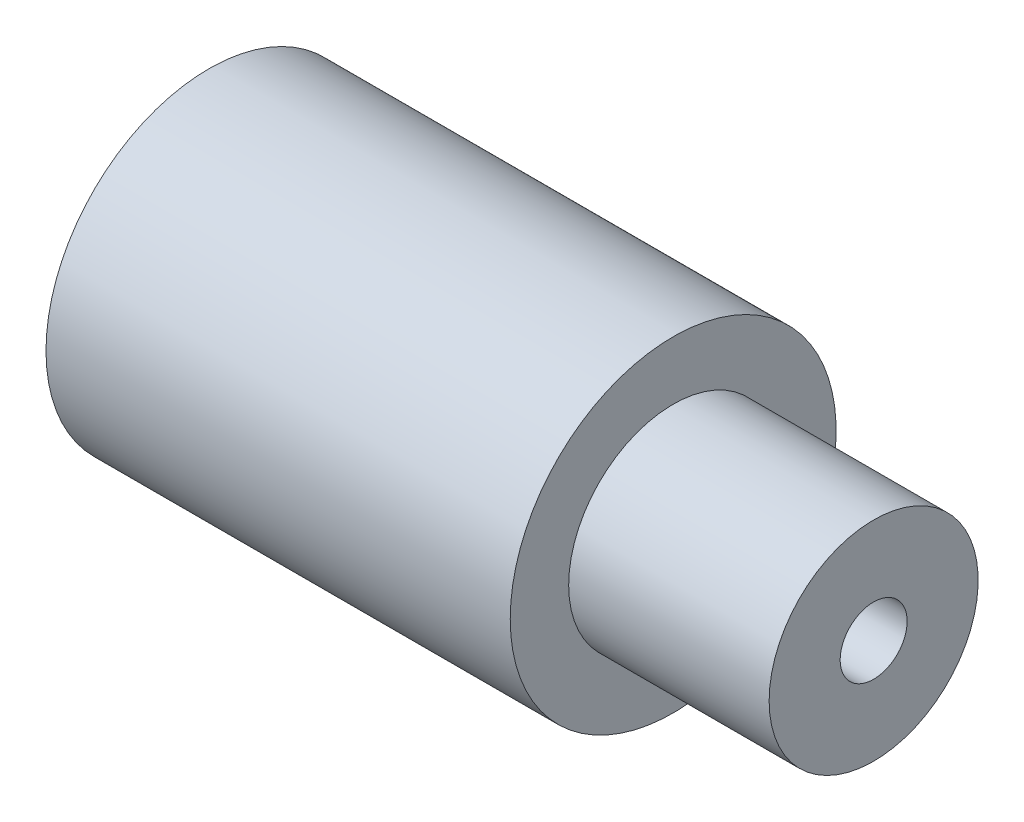
ISO-10303-21;
HEADER;
FILE_DESCRIPTION(('STEP AP214'),'2;1');
FILE_NAME('part.step','',(''),(''),'','','');
FILE_SCHEMA(('AUTOMOTIVE_DESIGN { 1 0 10303 214 1 1 1 1 }'));
ENDSEC;
DATA;
#1=APPLICATION_CONTEXT('core data for automotive mechanical design processes');
#2=APPLICATION_PROTOCOL_DEFINITION('international standard','automotive_design',2000,#1);
#3=PRODUCT_CONTEXT('',#1,'mechanical');
#4=PRODUCT('Part','Part','',(#3));
#5=PRODUCT_RELATED_PRODUCT_CATEGORY('part','',(#4));
#6=PRODUCT_DEFINITION_FORMATION('','',#4);
#7=PRODUCT_DEFINITION_CONTEXT('part definition',#1,'design');
#8=PRODUCT_DEFINITION('design','',#6,#7);
#9=PRODUCT_DEFINITION_SHAPE('','',#8);
#10=(LENGTH_UNIT() NAMED_UNIT(*) SI_UNIT(.MILLI.,.METRE.));
#11=(NAMED_UNIT(*) PLANE_ANGLE_UNIT() SI_UNIT($,.RADIAN.));
#12=(NAMED_UNIT(*) SI_UNIT($,.STERADIAN.) SOLID_ANGLE_UNIT());
#13=UNCERTAINTY_MEASURE_WITH_UNIT(LENGTH_MEASURE(1.E-05),#10,'distance_accuracy_value','');
#14=(GEOMETRIC_REPRESENTATION_CONTEXT(3) GLOBAL_UNCERTAINTY_ASSIGNED_CONTEXT((#13)) GLOBAL_UNIT_ASSIGNED_CONTEXT((#10,
#11,#12)) REPRESENTATION_CONTEXT('',''));
#15=CARTESIAN_POINT('',(0.,0.,0.));
#16=DIRECTION('',(0.,0.,1.));
#17=DIRECTION('',(1.,0.,0.));
#18=AXIS2_PLACEMENT_3D('',#15,#16,#17);
#19=CARTESIAN_POINT('',(9.5,0.,0.));
#20=DIRECTION('',(-1.,0.,0.));
#21=DIRECTION('',(0.,0.,1.));
#22=AXIS2_PLACEMENT_3D('',#19,#20,#21);
#23=PLANE('',#22);
#24=CARTESIAN_POINT('',(9.50000000000006,0.,0.));
#25=DIRECTION('',(-1.,0.,0.));
#26=DIRECTION('',(0.,0.,1.));
#27=AXIS2_PLACEMENT_3D('',#24,#25,#26);
#28=CIRCLE('',#27,1.5875);
#29=CARTESIAN_POINT('',(9.50000000000006,0.,1.5875));
#30=VERTEX_POINT('',#29);
#31=EDGE_CURVE('E59',#30,#30,#28,.F.);
#32=ORIENTED_EDGE('',*,*,#31,.F.);
#33=EDGE_LOOP('',(#32));
#34=FACE_BOUND('',#33,.T.);
#35=CARTESIAN_POINT('',(9.50000000000006,0.,0.));
#36=DIRECTION('',(-1.,0.,0.));
#37=DIRECTION('',(0.,0.,1.));
#38=AXIS2_PLACEMENT_3D('',#35,#36,#37);
#39=CIRCLE('',#38,4.953);
#40=CARTESIAN_POINT('',(9.50000000000006,0.,4.953));
#41=VERTEX_POINT('',#40);
#42=EDGE_CURVE('E10',#41,#41,#39,.T.);
#43=ORIENTED_EDGE('',*,*,#42,.F.);
#44=EDGE_LOOP('',(#43));
#45=FACE_BOUND('',#44,.T.);
#46=ADVANCED_FACE('F39',(#34,#45),#23,.F.);
#47=CARTESIAN_POINT('',(-1000.,0.,0.));
#48=DIRECTION('',(-1.,0.,0.));
#49=DIRECTION('',(0.,0.,1.));
#50=AXIS2_PLACEMENT_3D('',#47,#48,#49);
#51=CYLINDRICAL_SURFACE('',#50,4.953);
#52=CARTESIAN_POINT('',(0.,0.,0.));
#53=DIRECTION('',(-1.,0.,0.));
#54=DIRECTION('',(0.,0.,1.));
#55=AXIS2_PLACEMENT_3D('',#52,#53,#54);
#56=CIRCLE('',#55,4.953);
#57=CARTESIAN_POINT('',(0.,0.,4.953));
#58=VERTEX_POINT('',#57);
#59=EDGE_CURVE('E46',#58,#58,#56,.T.);
#60=ORIENTED_EDGE('',*,*,#59,.F.);
#61=EDGE_LOOP('',(#60));
#62=FACE_BOUND('',#61,.T.);
#63=ORIENTED_EDGE('',*,*,#42,.T.);
#64=EDGE_LOOP('',(#63));
#65=FACE_BOUND('',#64,.T.);
#66=ADVANCED_FACE('F84',(#62,#65),#51,.T.);
#67=CARTESIAN_POINT('',(0.,4.953,0.));
#68=DIRECTION('',(-1.,0.,0.));
#69=DIRECTION('',(0.,0.,1.));
#70=AXIS2_PLACEMENT_3D('',#67,#68,#69);
#71=PLANE('',#70);
#72=CARTESIAN_POINT('',(0.,0.,0.));
#73=DIRECTION('',(-1.,0.,0.));
#74=DIRECTION('',(0.,0.,1.));
#75=AXIS2_PLACEMENT_3D('',#72,#73,#74);
#76=CIRCLE('',#75,7.722);
#77=CARTESIAN_POINT('',(0.,0.,7.722));
#78=VERTEX_POINT('',#77);
#79=EDGE_CURVE('E49',#78,#78,#76,.T.);
#80=ORIENTED_EDGE('',*,*,#79,.F.);
#81=EDGE_LOOP('',(#80));
#82=FACE_BOUND('',#81,.T.);
#83=ORIENTED_EDGE('',*,*,#59,.T.);
#84=EDGE_LOOP('',(#83));
#85=FACE_BOUND('',#84,.T.);
#86=ADVANCED_FACE('F79',(#82,#85),#71,.F.);
#87=CARTESIAN_POINT('',(-1000.,0.,0.));
#88=DIRECTION('',(-1.,0.,0.));
#89=DIRECTION('',(0.,0.,1.));
#90=AXIS2_PLACEMENT_3D('',#87,#88,#89);
#91=CYLINDRICAL_SURFACE('',#90,7.722);
#92=CARTESIAN_POINT('',(-22.,0.,0.));
#93=DIRECTION('',(-1.,0.,0.));
#94=DIRECTION('',(0.,0.,1.));
#95=AXIS2_PLACEMENT_3D('',#92,#93,#94);
#96=CIRCLE('',#95,7.722);
#97=CARTESIAN_POINT('',(-22.,0.,7.722));
#98=VERTEX_POINT('',#97);
#99=EDGE_CURVE('E54',#98,#98,#96,.T.);
#100=ORIENTED_EDGE('',*,*,#99,.F.);
#101=EDGE_LOOP('',(#100));
#102=FACE_BOUND('',#101,.T.);
#103=ORIENTED_EDGE('',*,*,#79,.T.);
#104=EDGE_LOOP('',(#103));
#105=FACE_BOUND('',#104,.T.);
#106=ADVANCED_FACE('F68',(#102,#105),#91,.T.);
#107=CARTESIAN_POINT('',(-22.,7.722,0.));
#108=DIRECTION('',(1.,0.,0.));
#109=DIRECTION('',(0.,0.,-1.));
#110=AXIS2_PLACEMENT_3D('',#107,#108,#109);
#111=PLANE('',#110);
#112=CARTESIAN_POINT('',(-22.,0.,0.));
#113=DIRECTION('',(1.,0.,0.));
#114=DIRECTION('',(0.,0.,-1.));
#115=AXIS2_PLACEMENT_3D('',#112,#113,#114);
#116=CIRCLE('',#115,1.5875);
#117=CARTESIAN_POINT('',(-22.,0.,-1.5875));
#118=VERTEX_POINT('',#117);
#119=EDGE_CURVE('E45',#118,#118,#116,.F.);
#120=ORIENTED_EDGE('',*,*,#119,.F.);
#121=EDGE_LOOP('',(#120));
#122=FACE_BOUND('',#121,.T.);
#123=ORIENTED_EDGE('',*,*,#99,.T.);
#124=EDGE_LOOP('',(#123));
#125=FACE_BOUND('',#124,.T.);
#126=ADVANCED_FACE('F69',(#122,#125),#111,.F.);
#127=CARTESIAN_POINT('',(-1000.,0.,0.));
#128=DIRECTION('',(-1.,0.,0.));
#129=DIRECTION('',(0.,0.,1.));
#130=AXIS2_PLACEMENT_3D('',#127,#128,#129);
#131=CYLINDRICAL_SURFACE('',#130,1.5875);
#132=ORIENTED_EDGE('',*,*,#119,.T.);
#133=EDGE_LOOP('',(#132));
#134=FACE_BOUND('',#133,.T.);
#135=ORIENTED_EDGE('',*,*,#31,.T.);
#136=EDGE_LOOP('',(#135));
#137=FACE_BOUND('',#136,.T.);
#138=ADVANCED_FACE('F62',(#134,#137),#131,.F.);
#139=CLOSED_SHELL('',(#46,#66,#86,#106,#126,#138));
#140=MANIFOLD_SOLID_BREP('B2',#139);
#141=ADVANCED_BREP_SHAPE_REPRESENTATION('',(#18,#140),#14);
#142=SHAPE_DEFINITION_REPRESENTATION(#9,#141);
ENDSEC;
END-ISO-10303-21;
